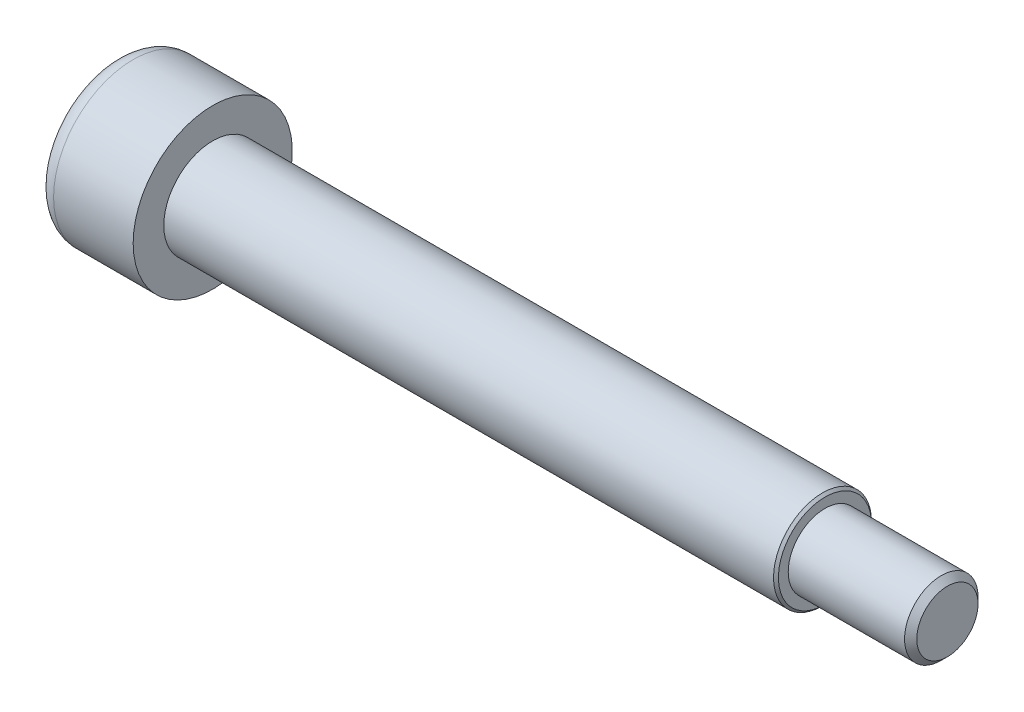
ISO-10303-21;
HEADER;
FILE_DESCRIPTION(('STEP AP214'),'2;1');
FILE_NAME('part.step','',(''),(''),'','','');
FILE_SCHEMA(('AUTOMOTIVE_DESIGN { 1 0 10303 214 1 1 1 1 }'));
ENDSEC;
DATA;
#1=APPLICATION_CONTEXT('core data for automotive mechanical design processes');
#2=APPLICATION_PROTOCOL_DEFINITION('international standard','automotive_design',2000,#1);
#3=PRODUCT_CONTEXT('',#1,'mechanical');
#4=PRODUCT('Part','Part','',(#3));
#5=PRODUCT_RELATED_PRODUCT_CATEGORY('part','',(#4));
#6=PRODUCT_DEFINITION_FORMATION('','',#4);
#7=PRODUCT_DEFINITION_CONTEXT('part definition',#1,'design');
#8=PRODUCT_DEFINITION('design','',#6,#7);
#9=PRODUCT_DEFINITION_SHAPE('','',#8);
#10=(LENGTH_UNIT() NAMED_UNIT(*) SI_UNIT(.MILLI.,.METRE.));
#11=(NAMED_UNIT(*) PLANE_ANGLE_UNIT() SI_UNIT($,.RADIAN.));
#12=(NAMED_UNIT(*) SI_UNIT($,.STERADIAN.) SOLID_ANGLE_UNIT());
#13=UNCERTAINTY_MEASURE_WITH_UNIT(LENGTH_MEASURE(1.E-05),#10,'distance_accuracy_value','');
#14=(GEOMETRIC_REPRESENTATION_CONTEXT(3) GLOBAL_UNCERTAINTY_ASSIGNED_CONTEXT((#13)) GLOBAL_UNIT_ASSIGNED_CONTEXT((#10,
#11,#12)) REPRESENTATION_CONTEXT('',''));
#15=CARTESIAN_POINT('',(0.,0.,0.));
#16=DIRECTION('',(0.,0.,1.));
#17=DIRECTION('',(1.,0.,0.));
#18=AXIS2_PLACEMENT_3D('',#15,#16,#17);
#19=CARTESIAN_POINT('',(60.,0.,0.));
#20=DIRECTION('',(1.,0.,0.));
#21=DIRECTION('',(0.,0.,-1.));
#22=AXIS2_PLACEMENT_3D('',#19,#20,#21);
#23=PLANE('',#22);
#24=CARTESIAN_POINT('',(60.,0.,0.));
#25=DIRECTION('',(1.,0.,0.));
#26=DIRECTION('',(0.,0.,-1.));
#27=AXIS2_PLACEMENT_3D('',#24,#25,#26);
#28=CIRCLE('',#27,2.5);
#29=CARTESIAN_POINT('',(60.,0.,-2.5));
#30=VERTEX_POINT('',#29);
#31=EDGE_CURVE('E50',#30,#30,#28,.T.);
#32=ORIENTED_EDGE('',*,*,#31,.T.);
#33=EDGE_LOOP('',(#32));
#34=FACE_BOUND('',#33,.T.);
#35=ADVANCED_FACE('F31',(#34),#23,.T.);
#36=CARTESIAN_POINT('',(0.,0.,0.));
#37=DIRECTION('',(-1.,0.,0.));
#38=DIRECTION('',(0.,0.,1.));
#39=AXIS2_PLACEMENT_3D('',#36,#37,#38);
#40=CYLINDRICAL_SURFACE('',#39,3.);
#41=CARTESIAN_POINT('',(59.5,0.,0.));
#42=DIRECTION('',(1.,0.,0.));
#43=DIRECTION('',(0.,0.,-1.));
#44=AXIS2_PLACEMENT_3D('',#41,#42,#43);
#45=CIRCLE('',#44,3.);
#46=CARTESIAN_POINT('',(59.5,0.,-3.));
#47=VERTEX_POINT('',#46);
#48=EDGE_CURVE('E53',#47,#47,#45,.F.);
#49=ORIENTED_EDGE('',*,*,#48,.T.);
#50=EDGE_LOOP('',(#49));
#51=FACE_BOUND('',#50,.T.);
#52=CARTESIAN_POINT('',(50.,0.,0.));
#53=DIRECTION('',(-1.,0.,0.));
#54=DIRECTION('',(0.,0.,1.));
#55=AXIS2_PLACEMENT_3D('',#52,#53,#54);
#56=CIRCLE('',#55,3.);
#57=CARTESIAN_POINT('',(50.,0.,3.));
#58=VERTEX_POINT('',#57);
#59=EDGE_CURVE('E56',#58,#58,#56,.T.);
#60=ORIENTED_EDGE('',*,*,#59,.F.);
#61=EDGE_LOOP('',(#60));
#62=FACE_BOUND('',#61,.T.);
#63=ADVANCED_FACE('F83',(#51,#62),#40,.T.);
#64=CARTESIAN_POINT('',(50.,-3.,0.));
#65=DIRECTION('',(1.,0.,0.));
#66=DIRECTION('',(0.,0.,-1.));
#67=AXIS2_PLACEMENT_3D('',#64,#65,#66);
#68=PLANE('',#67);
#69=CARTESIAN_POINT('',(50.,0.,0.));
#70=DIRECTION('',(1.,0.,0.));
#71=DIRECTION('',(0.,0.,-1.));
#72=AXIS2_PLACEMENT_3D('',#69,#70,#71);
#73=CIRCLE('',#72,3.8);
#74=CARTESIAN_POINT('',(50.,0.,-3.8));
#75=VERTEX_POINT('',#74);
#76=EDGE_CURVE('E10',#75,#75,#73,.T.);
#77=ORIENTED_EDGE('',*,*,#76,.T.);
#78=EDGE_LOOP('',(#77));
#79=FACE_BOUND('',#78,.T.);
#80=ORIENTED_EDGE('',*,*,#59,.T.);
#81=EDGE_LOOP('',(#80));
#82=FACE_BOUND('',#81,.T.);
#83=ADVANCED_FACE('F80',(#79,#82),#68,.T.);
#84=CARTESIAN_POINT('',(0.,0.,0.));
#85=DIRECTION('',(-1.,0.,0.));
#86=DIRECTION('',(0.,0.,1.));
#87=AXIS2_PLACEMENT_3D('',#84,#85,#86);
#88=CYLINDRICAL_SURFACE('',#87,4.);
#89=CARTESIAN_POINT('',(49.8,0.,0.));
#90=DIRECTION('',(1.,0.,0.));
#91=DIRECTION('',(0.,0.,-1.));
#92=AXIS2_PLACEMENT_3D('',#89,#90,#91);
#93=CIRCLE('',#92,4.);
#94=CARTESIAN_POINT('',(49.8,0.,-4.));
#95=VERTEX_POINT('',#94);
#96=EDGE_CURVE('E37',#95,#95,#93,.F.);
#97=ORIENTED_EDGE('',*,*,#96,.T.);
#98=EDGE_LOOP('',(#97));
#99=FACE_BOUND('',#98,.T.);
#100=CARTESIAN_POINT('',(0.,0.,0.));
#101=DIRECTION('',(-1.,0.,0.));
#102=DIRECTION('',(0.,0.,1.));
#103=AXIS2_PLACEMENT_3D('',#100,#101,#102);
#104=CIRCLE('',#103,4.);
#105=CARTESIAN_POINT('',(0.,0.,4.));
#106=VERTEX_POINT('',#105);
#107=EDGE_CURVE('E59',#106,#106,#104,.T.);
#108=ORIENTED_EDGE('',*,*,#107,.F.);
#109=EDGE_LOOP('',(#108));
#110=FACE_BOUND('',#109,.T.);
#111=ADVANCED_FACE('F70',(#99,#110),#88,.T.);
#112=CARTESIAN_POINT('',(0.,-4.,0.));
#113=DIRECTION('',(1.,0.,0.));
#114=DIRECTION('',(0.,0.,-1.));
#115=AXIS2_PLACEMENT_3D('',#112,#113,#114);
#116=PLANE('',#115);
#117=ORIENTED_EDGE('',*,*,#107,.T.);
#118=EDGE_LOOP('',(#117));
#119=FACE_BOUND('',#118,.T.);
#120=CARTESIAN_POINT('',(0.,0.,0.));
#121=DIRECTION('',(-1.,0.,0.));
#122=DIRECTION('',(0.,0.,1.));
#123=AXIS2_PLACEMENT_3D('',#120,#121,#122);
#124=CIRCLE('',#123,6.5);
#125=CARTESIAN_POINT('',(0.,0.,6.5));
#126=VERTEX_POINT('',#125);
#127=EDGE_CURVE('E62',#126,#126,#124,.T.);
#128=ORIENTED_EDGE('',*,*,#127,.F.);
#129=EDGE_LOOP('',(#128));
#130=FACE_BOUND('',#129,.T.);
#131=ADVANCED_FACE('F68',(#119,#130),#116,.T.);
#132=CARTESIAN_POINT('',(0.,0.,0.));
#133=DIRECTION('',(-1.,0.,0.));
#134=DIRECTION('',(0.,0.,1.));
#135=AXIS2_PLACEMENT_3D('',#132,#133,#134);
#136=CYLINDRICAL_SURFACE('',#135,6.5);
#137=CARTESIAN_POINT('',(-6.5,0.,0.));
#138=DIRECTION('',(-1.,0.,0.));
#139=DIRECTION('',(0.,0.,1.));
#140=AXIS2_PLACEMENT_3D('',#137,#138,#139);
#141=CIRCLE('',#140,6.5);
#142=CARTESIAN_POINT('',(-6.5,0.,6.5));
#143=VERTEX_POINT('',#142);
#144=EDGE_CURVE('E41',#143,#143,#141,.F.);
#145=ORIENTED_EDGE('',*,*,#144,.T.);
#146=EDGE_LOOP('',(#145));
#147=FACE_BOUND('',#146,.T.);
#148=ORIENTED_EDGE('',*,*,#127,.T.);
#149=EDGE_LOOP('',(#148));
#150=FACE_BOUND('',#149,.T.);
#151=ADVANCED_FACE('F66',(#147,#150),#136,.T.);
#152=CARTESIAN_POINT('',(-8.,-6.5,0.));
#153=DIRECTION('',(-1.,0.,0.));
#154=DIRECTION('',(0.,0.,1.));
#155=AXIS2_PLACEMENT_3D('',#152,#153,#154);
#156=PLANE('',#155);
#157=CARTESIAN_POINT('',(-8.,0.,0.));
#158=DIRECTION('',(-1.,0.,0.));
#159=DIRECTION('',(0.,0.,1.));
#160=AXIS2_PLACEMENT_3D('',#157,#158,#159);
#161=CIRCLE('',#160,5.);
#162=CARTESIAN_POINT('',(-8.,0.,5.));
#163=VERTEX_POINT('',#162);
#164=EDGE_CURVE('E45',#163,#163,#161,.T.);
#165=ORIENTED_EDGE('',*,*,#164,.T.);
#166=EDGE_LOOP('',(#165));
#167=FACE_BOUND('',#166,.T.);
#168=ADVANCED_FACE('F77',(#167),#156,.T.);
#169=CARTESIAN_POINT('',(59.5,0.,0.));
#170=DIRECTION('',(-1.,0.,0.));
#171=DIRECTION('',(0.,0.,1.));
#172=AXIS2_PLACEMENT_3D('',#169,#170,#171);
#173=CONICAL_SURFACE('',#172,3.,0.785398163397444);
#174=ORIENTED_EDGE('',*,*,#31,.F.);
#175=EDGE_LOOP('',(#174));
#176=FACE_BOUND('',#175,.T.);
#177=ORIENTED_EDGE('',*,*,#48,.F.);
#178=EDGE_LOOP('',(#177));
#179=FACE_BOUND('',#178,.T.);
#180=ADVANCED_FACE('F91',(#176,#179),#173,.T.);
#181=CARTESIAN_POINT('',(-6.5,0.,0.));
#182=DIRECTION('',(-1.,0.,0.));
#183=DIRECTION('',(0.,0.,1.));
#184=AXIS2_PLACEMENT_3D('',#181,#182,#183);
#185=TOROIDAL_SURFACE('',#184,5.,1.5);
#186=ORIENTED_EDGE('',*,*,#144,.F.);
#187=EDGE_LOOP('',(#186));
#188=FACE_BOUND('',#187,.T.);
#189=ORIENTED_EDGE('',*,*,#164,.F.);
#190=EDGE_LOOP('',(#189));
#191=FACE_BOUND('',#190,.T.);
#192=ADVANCED_FACE('F94',(#188,#191),#185,.T.);
#193=CARTESIAN_POINT('',(49.8,0.,0.));
#194=DIRECTION('',(-1.,0.,0.));
#195=DIRECTION('',(0.,0.,1.));
#196=AXIS2_PLACEMENT_3D('',#193,#194,#195);
#197=CONICAL_SURFACE('',#196,4.,0.785398163397441);
#198=ORIENTED_EDGE('',*,*,#76,.F.);
#199=EDGE_LOOP('',(#198));
#200=FACE_BOUND('',#199,.T.);
#201=ORIENTED_EDGE('',*,*,#96,.F.);
#202=EDGE_LOOP('',(#201));
#203=FACE_BOUND('',#202,.T.);
#204=ADVANCED_FACE('F144',(#200,#203),#197,.T.);
#205=CLOSED_SHELL('',(#35,#63,#83,#111,#131,#151,#168,#180,#192,#204));
#206=MANIFOLD_SOLID_BREP('B2',#205);
#207=ADVANCED_BREP_SHAPE_REPRESENTATION('',(#18,#206),#14);
#208=SHAPE_DEFINITION_REPRESENTATION(#9,#207);
ENDSEC;
END-ISO-10303-21;
